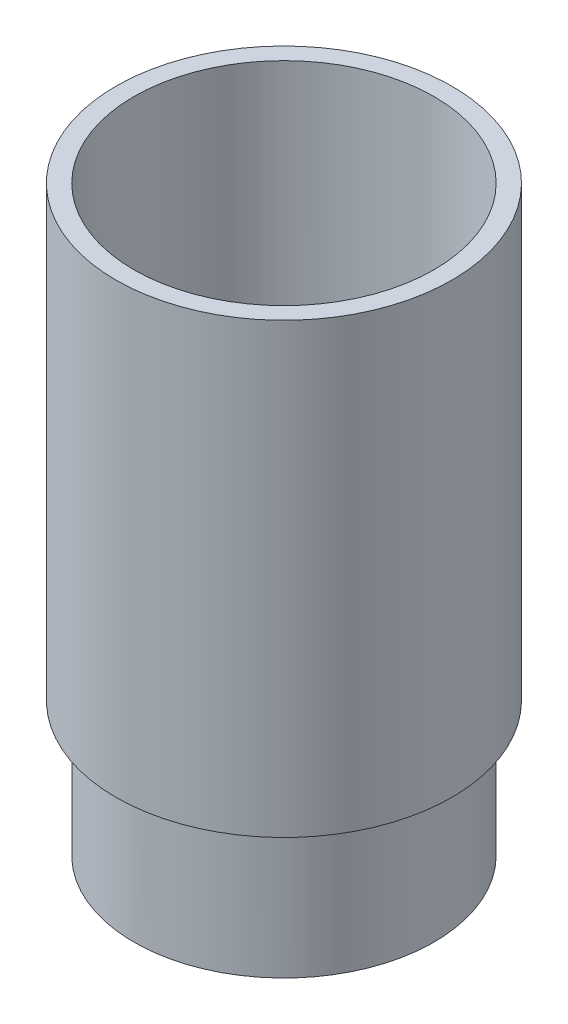
ISO-10303-21;
HEADER;
FILE_DESCRIPTION(('STEP AP214'),'2;1');
FILE_NAME('part.step','',(''),(''),'','','');
FILE_SCHEMA(('AUTOMOTIVE_DESIGN { 1 0 10303 214 1 1 1 1 }'));
ENDSEC;
DATA;
#1=APPLICATION_CONTEXT('core data for automotive mechanical design processes');
#2=APPLICATION_PROTOCOL_DEFINITION('international standard','automotive_design',2000,#1);
#3=PRODUCT_CONTEXT('',#1,'mechanical');
#4=PRODUCT('Part','Part','',(#3));
#5=PRODUCT_RELATED_PRODUCT_CATEGORY('part','',(#4));
#6=PRODUCT_DEFINITION_FORMATION('','',#4);
#7=PRODUCT_DEFINITION_CONTEXT('part definition',#1,'design');
#8=PRODUCT_DEFINITION('design','',#6,#7);
#9=PRODUCT_DEFINITION_SHAPE('','',#8);
#10=(LENGTH_UNIT() NAMED_UNIT(*) SI_UNIT(.MILLI.,.METRE.));
#11=(NAMED_UNIT(*) PLANE_ANGLE_UNIT() SI_UNIT($,.RADIAN.));
#12=(NAMED_UNIT(*) SI_UNIT($,.STERADIAN.) SOLID_ANGLE_UNIT());
#13=UNCERTAINTY_MEASURE_WITH_UNIT(LENGTH_MEASURE(1.E-05),#10,'distance_accuracy_value','');
#14=(GEOMETRIC_REPRESENTATION_CONTEXT(3) GLOBAL_UNCERTAINTY_ASSIGNED_CONTEXT((#13)) GLOBAL_UNIT_ASSIGNED_CONTEXT((#10,
#11,#12)) REPRESENTATION_CONTEXT('',''));
#15=CARTESIAN_POINT('',(0.,0.,0.));
#16=DIRECTION('',(0.,0.,1.));
#17=DIRECTION('',(1.,0.,0.));
#18=AXIS2_PLACEMENT_3D('',#15,#16,#17);
#19=CARTESIAN_POINT('',(0.,100.,0.));
#20=DIRECTION('',(0.,-1.,0.));
#21=DIRECTION('',(0.,0.,-1.));
#22=AXIS2_PLACEMENT_3D('',#19,#20,#21);
#23=CYLINDRICAL_SURFACE('',#22,33.5);
#24=CARTESIAN_POINT('',(0.,100.,0.));
#25=DIRECTION('',(0.,1.,0.));
#26=DIRECTION('',(0.,0.,1.));
#27=AXIS2_PLACEMENT_3D('',#24,#25,#26);
#28=CIRCLE('',#27,33.5);
#29=CARTESIAN_POINT('',(0.,100.,33.5));
#30=VERTEX_POINT('',#29);
#31=EDGE_CURVE('E53',#30,#30,#28,.T.);
#32=ORIENTED_EDGE('',*,*,#31,.T.);
#33=EDGE_LOOP('',(#32));
#34=FACE_BOUND('',#33,.T.);
#35=CARTESIAN_POINT('',(0.,5.,0.));
#36=DIRECTION('',(0.,-1.,0.));
#37=DIRECTION('',(0.,0.,-1.));
#38=AXIS2_PLACEMENT_3D('',#35,#36,#37);
#39=CIRCLE('',#38,33.5);
#40=CARTESIAN_POINT('',(0.,5.,-33.5));
#41=VERTEX_POINT('',#40);
#42=EDGE_CURVE('E62',#41,#41,#39,.T.);
#43=ORIENTED_EDGE('',*,*,#42,.T.);
#44=EDGE_LOOP('',(#43));
#45=FACE_BOUND('',#44,.T.);
#46=ADVANCED_FACE('F40',(#34,#45),#23,.F.);
#47=CARTESIAN_POINT('',(0.,100.,0.));
#48=DIRECTION('',(0.,1.,0.));
#49=DIRECTION('',(0.,0.,1.));
#50=AXIS2_PLACEMENT_3D('',#47,#48,#49);
#51=PLANE('',#50);
#52=CARTESIAN_POINT('',(0.,100.,0.));
#53=DIRECTION('',(0.,1.,0.));
#54=DIRECTION('',(0.,0.,1.));
#55=AXIS2_PLACEMENT_3D('',#52,#53,#54);
#56=CIRCLE('',#55,37.5);
#57=CARTESIAN_POINT('',(0.,100.,37.5));
#58=VERTEX_POINT('',#57);
#59=EDGE_CURVE('E10',#58,#58,#56,.T.);
#60=ORIENTED_EDGE('',*,*,#59,.T.);
#61=EDGE_LOOP('',(#60));
#62=FACE_BOUND('',#61,.T.);
#63=ORIENTED_EDGE('',*,*,#31,.F.);
#64=EDGE_LOOP('',(#63));
#65=FACE_BOUND('',#64,.T.);
#66=ADVANCED_FACE('F92',(#62,#65),#51,.T.);
#67=CARTESIAN_POINT('',(0.,0.,0.));
#68=DIRECTION('',(0.,1.,0.));
#69=DIRECTION('',(0.,0.,1.));
#70=AXIS2_PLACEMENT_3D('',#67,#68,#69);
#71=PLANE('',#70);
#72=CARTESIAN_POINT('',(0.,0.,0.));
#73=DIRECTION('',(0.,1.,0.));
#74=DIRECTION('',(0.,0.,1.));
#75=AXIS2_PLACEMENT_3D('',#72,#73,#74);
#76=CIRCLE('',#75,37.5);
#77=CARTESIAN_POINT('',(0.,0.,37.5));
#78=VERTEX_POINT('',#77);
#79=EDGE_CURVE('E44',#78,#78,#76,.T.);
#80=ORIENTED_EDGE('',*,*,#79,.F.);
#81=EDGE_LOOP('',(#80));
#82=FACE_BOUND('',#81,.T.);
#83=CARTESIAN_POINT('',(0.,0.,0.));
#84=DIRECTION('',(0.,1.,0.));
#85=DIRECTION('',(0.,0.,1.));
#86=AXIS2_PLACEMENT_3D('',#83,#84,#85);
#87=CIRCLE('',#86,33.5);
#88=CARTESIAN_POINT('',(0.,0.,33.5));
#89=VERTEX_POINT('',#88);
#90=EDGE_CURVE('E58',#89,#89,#87,.T.);
#91=ORIENTED_EDGE('',*,*,#90,.T.);
#92=EDGE_LOOP('',(#91));
#93=FACE_BOUND('',#92,.T.);
#94=ADVANCED_FACE('F98',(#82,#93),#71,.F.);
#95=CARTESIAN_POINT('',(0.,100.,0.));
#96=DIRECTION('',(0.,-1.,0.));
#97=DIRECTION('',(0.,0.,-1.));
#98=AXIS2_PLACEMENT_3D('',#95,#96,#97);
#99=CYLINDRICAL_SURFACE('',#98,37.5);
#100=ORIENTED_EDGE('',*,*,#59,.F.);
#101=EDGE_LOOP('',(#100));
#102=FACE_BOUND('',#101,.T.);
#103=ORIENTED_EDGE('',*,*,#79,.T.);
#104=EDGE_LOOP('',(#103));
#105=FACE_BOUND('',#104,.T.);
#106=ADVANCED_FACE('F42',(#102,#105),#99,.T.);
#107=CARTESIAN_POINT('',(0.,5.,0.));
#108=DIRECTION('',(0.,-1.,0.));
#109=DIRECTION('',(0.,0.,-1.));
#110=AXIS2_PLACEMENT_3D('',#107,#108,#109);
#111=CYLINDRICAL_SURFACE('',#110,33.5);
#112=CARTESIAN_POINT('',(0.,-30.,0.));
#113=DIRECTION('',(0.,-1.,0.));
#114=DIRECTION('',(0.,0.,-1.));
#115=AXIS2_PLACEMENT_3D('',#112,#113,#114);
#116=CIRCLE('',#115,33.5);
#117=CARTESIAN_POINT('',(0.,-30.,-33.5));
#118=VERTEX_POINT('',#117);
#119=EDGE_CURVE('E70',#118,#118,#116,.T.);
#120=ORIENTED_EDGE('',*,*,#119,.F.);
#121=EDGE_LOOP('',(#120));
#122=FACE_BOUND('',#121,.T.);
#123=ORIENTED_EDGE('',*,*,#90,.F.);
#124=EDGE_LOOP('',(#123));
#125=FACE_BOUND('',#124,.T.);
#126=ADVANCED_FACE('F102',(#122,#125),#111,.T.);
#127=CARTESIAN_POINT('',(0.,5.,0.));
#128=DIRECTION('',(0.,-1.,0.));
#129=DIRECTION('',(0.,0.,-1.));
#130=AXIS2_PLACEMENT_3D('',#127,#128,#129);
#131=PLANE('',#130);
#132=CARTESIAN_POINT('',(0.,5.,0.));
#133=DIRECTION('',(0.,-1.,0.));
#134=DIRECTION('',(0.,0.,-1.));
#135=AXIS2_PLACEMENT_3D('',#132,#133,#134);
#136=CIRCLE('',#135,29.5);
#137=CARTESIAN_POINT('',(0.,5.,-29.5));
#138=VERTEX_POINT('',#137);
#139=EDGE_CURVE('E66',#138,#138,#136,.T.);
#140=ORIENTED_EDGE('',*,*,#139,.T.);
#141=EDGE_LOOP('',(#140));
#142=FACE_BOUND('',#141,.T.);
#143=ORIENTED_EDGE('',*,*,#42,.F.);
#144=EDGE_LOOP('',(#143));
#145=FACE_BOUND('',#144,.T.);
#146=ADVANCED_FACE('F88',(#142,#145),#131,.F.);
#147=CARTESIAN_POINT('',(0.,5.,0.));
#148=DIRECTION('',(0.,-1.,0.));
#149=DIRECTION('',(0.,0.,-1.));
#150=AXIS2_PLACEMENT_3D('',#147,#148,#149);
#151=CYLINDRICAL_SURFACE('',#150,29.5);
#152=ORIENTED_EDGE('',*,*,#139,.F.);
#153=EDGE_LOOP('',(#152));
#154=FACE_BOUND('',#153,.T.);
#155=CARTESIAN_POINT('',(0.,-30.,0.));
#156=DIRECTION('',(0.,-1.,0.));
#157=DIRECTION('',(0.,0.,-1.));
#158=AXIS2_PLACEMENT_3D('',#155,#156,#157);
#159=CIRCLE('',#158,29.5);
#160=CARTESIAN_POINT('',(0.,-30.,-29.5));
#161=VERTEX_POINT('',#160);
#162=EDGE_CURVE('E74',#161,#161,#159,.T.);
#163=ORIENTED_EDGE('',*,*,#162,.T.);
#164=EDGE_LOOP('',(#163));
#165=FACE_BOUND('',#164,.T.);
#166=ADVANCED_FACE('F79',(#154,#165),#151,.F.);
#167=CARTESIAN_POINT('',(0.,-30.,0.));
#168=DIRECTION('',(0.,-1.,0.));
#169=DIRECTION('',(0.,0.,-1.));
#170=AXIS2_PLACEMENT_3D('',#167,#168,#169);
#171=PLANE('',#170);
#172=ORIENTED_EDGE('',*,*,#119,.T.);
#173=EDGE_LOOP('',(#172));
#174=FACE_BOUND('',#173,.T.);
#175=ORIENTED_EDGE('',*,*,#162,.F.);
#176=EDGE_LOOP('',(#175));
#177=FACE_BOUND('',#176,.T.);
#178=ADVANCED_FACE('F81',(#174,#177),#171,.T.);
#179=CLOSED_SHELL('',(#46,#66,#94,#106,#126,#146,#166,#178));
#180=MANIFOLD_SOLID_BREP('B2',#179);
#181=ADVANCED_BREP_SHAPE_REPRESENTATION('',(#18,#180),#14);
#182=SHAPE_DEFINITION_REPRESENTATION(#9,#181);
ENDSEC;
END-ISO-10303-21;
